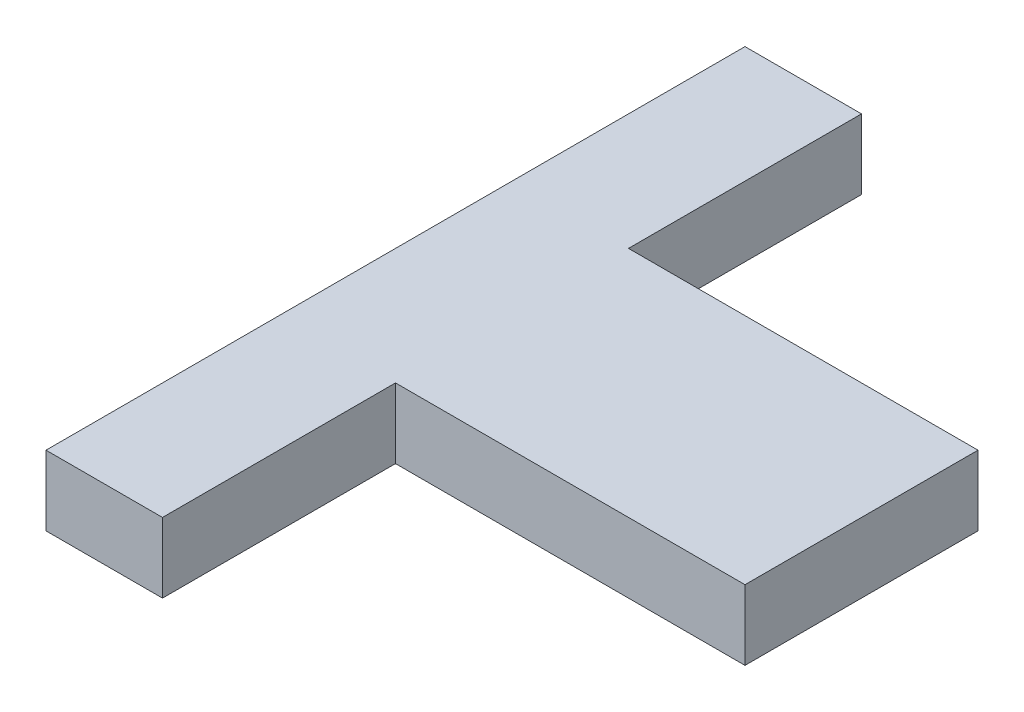
ISO-10303-21;
HEADER;
FILE_DESCRIPTION(('STEP AP214'),'2;1');
FILE_NAME('part.step','',(''),(''),'','','');
FILE_SCHEMA(('AUTOMOTIVE_DESIGN { 1 0 10303 214 1 1 1 1 }'));
ENDSEC;
DATA;
#1=APPLICATION_CONTEXT('core data for automotive mechanical design processes');
#2=APPLICATION_PROTOCOL_DEFINITION('international standard','automotive_design',2000,#1);
#3=PRODUCT_CONTEXT('',#1,'mechanical');
#4=PRODUCT('Part','Part','',(#3));
#5=PRODUCT_RELATED_PRODUCT_CATEGORY('part','',(#4));
#6=PRODUCT_DEFINITION_FORMATION('','',#4);
#7=PRODUCT_DEFINITION_CONTEXT('part definition',#1,'design');
#8=PRODUCT_DEFINITION('design','',#6,#7);
#9=PRODUCT_DEFINITION_SHAPE('','',#8);
#10=(LENGTH_UNIT() NAMED_UNIT(*) SI_UNIT(.MILLI.,.METRE.));
#11=(NAMED_UNIT(*) PLANE_ANGLE_UNIT() SI_UNIT($,.RADIAN.));
#12=(NAMED_UNIT(*) SI_UNIT($,.STERADIAN.) SOLID_ANGLE_UNIT());
#13=UNCERTAINTY_MEASURE_WITH_UNIT(LENGTH_MEASURE(1.E-05),#10,'distance_accuracy_value','');
#14=(GEOMETRIC_REPRESENTATION_CONTEXT(3) GLOBAL_UNCERTAINTY_ASSIGNED_CONTEXT((#13)) GLOBAL_UNIT_ASSIGNED_CONTEXT((#10,
#11,#12)) REPRESENTATION_CONTEXT('',''));
#15=CARTESIAN_POINT('',(0.,0.,0.));
#16=DIRECTION('',(0.,0.,1.));
#17=DIRECTION('',(1.,0.,0.));
#18=AXIS2_PLACEMENT_3D('',#15,#16,#17);
#19=CARTESIAN_POINT('',(10.,6.,0.));
#20=DIRECTION('',(1.,0.,0.));
#21=DIRECTION('',(0.,0.,-1.));
#22=AXIS2_PLACEMENT_3D('',#19,#20,#21);
#23=PLANE('',#22);
#24=DIRECTION('',(0.,0.,1.));
#25=VECTOR('',#24,1.);
#26=CARTESIAN_POINT('',(10.,0.,0.));
#27=LINE('',#26,#25);
#28=CARTESIAN_POINT('',(10.,0.,0.));
#29=VERTEX_POINT('',#28);
#30=CARTESIAN_POINT('',(10.,0.,20.));
#31=VERTEX_POINT('',#30);
#32=EDGE_CURVE('E128',#29,#31,#27,.T.);
#33=ORIENTED_EDGE('',*,*,#32,.F.);
#34=DIRECTION('',(0.,-1.,0.));
#35=VECTOR('',#34,1.);
#36=CARTESIAN_POINT('',(10.,6.,0.));
#37=LINE('',#36,#35);
#38=CARTESIAN_POINT('',(10.,6.,0.));
#39=VERTEX_POINT('',#38);
#40=EDGE_CURVE('E11',#39,#29,#37,.T.);
#41=ORIENTED_EDGE('',*,*,#40,.F.);
#42=DIRECTION('',(0.,0.,1.));
#43=VECTOR('',#42,1.);
#44=CARTESIAN_POINT('',(10.,6.,0.));
#45=LINE('',#44,#43);
#46=CARTESIAN_POINT('',(10.,6.,20.));
#47=VERTEX_POINT('',#46);
#48=EDGE_CURVE('E145',#39,#47,#45,.T.);
#49=ORIENTED_EDGE('',*,*,#48,.T.);
#50=DIRECTION('',(0.,-1.,0.));
#51=VECTOR('',#50,1.);
#52=CARTESIAN_POINT('',(10.,6.,20.));
#53=LINE('',#52,#51);
#54=EDGE_CURVE('E52',#47,#31,#53,.T.);
#55=ORIENTED_EDGE('',*,*,#54,.T.);
#56=EDGE_LOOP('',(#33,#41,#49,#55));
#57=FACE_BOUND('',#56,.T.);
#58=ADVANCED_FACE('F35',(#57),#23,.T.);
#59=CARTESIAN_POINT('',(0.,6.,0.));
#60=DIRECTION('',(0.,0.,-1.));
#61=DIRECTION('',(-1.,0.,0.));
#62=AXIS2_PLACEMENT_3D('',#59,#60,#61);
#63=PLANE('',#62);
#64=DIRECTION('',(1.,0.,0.));
#65=VECTOR('',#64,1.);
#66=CARTESIAN_POINT('',(0.,0.,0.));
#67=LINE('',#66,#65);
#68=CARTESIAN_POINT('',(0.,0.,0.));
#69=VERTEX_POINT('',#68);
#70=EDGE_CURVE('E130',#69,#29,#67,.T.);
#71=ORIENTED_EDGE('',*,*,#70,.F.);
#72=DIRECTION('',(0.,-1.,0.));
#73=VECTOR('',#72,1.);
#74=CARTESIAN_POINT('',(0.,6.,0.));
#75=LINE('',#74,#73);
#76=CARTESIAN_POINT('',(0.,6.,0.));
#77=VERTEX_POINT('',#76);
#78=EDGE_CURVE('E44',#77,#69,#75,.T.);
#79=ORIENTED_EDGE('',*,*,#78,.F.);
#80=DIRECTION('',(1.,0.,0.));
#81=VECTOR('',#80,1.);
#82=CARTESIAN_POINT('',(0.,6.,0.));
#83=LINE('',#82,#81);
#84=EDGE_CURVE('E167',#77,#39,#83,.T.);
#85=ORIENTED_EDGE('',*,*,#84,.T.);
#86=ORIENTED_EDGE('',*,*,#40,.T.);
#87=EDGE_LOOP('',(#71,#79,#85,#86));
#88=FACE_BOUND('',#87,.T.);
#89=ADVANCED_FACE('F37',(#88),#63,.T.);
#90=CARTESIAN_POINT('',(0.,6.,0.));
#91=DIRECTION('',(1.,0.,0.));
#92=DIRECTION('',(0.,0.,-1.));
#93=AXIS2_PLACEMENT_3D('',#90,#91,#92);
#94=PLANE('',#93);
#95=DIRECTION('',(0.,0.,1.));
#96=VECTOR('',#95,1.);
#97=CARTESIAN_POINT('',(0.,0.,0.));
#98=LINE('',#97,#96);
#99=CARTESIAN_POINT('',(0.,0.,60.));
#100=VERTEX_POINT('',#99);
#101=EDGE_CURVE('E134',#69,#100,#98,.T.);
#102=ORIENTED_EDGE('',*,*,#101,.T.);
#103=DIRECTION('',(0.,-1.,0.));
#104=VECTOR('',#103,1.);
#105=CARTESIAN_POINT('',(0.,6.,60.));
#106=LINE('',#105,#104);
#107=CARTESIAN_POINT('',(0.,6.,60.));
#108=VERTEX_POINT('',#107);
#109=EDGE_CURVE('E151',#108,#100,#106,.T.);
#110=ORIENTED_EDGE('',*,*,#109,.F.);
#111=DIRECTION('',(0.,0.,1.));
#112=VECTOR('',#111,1.);
#113=CARTESIAN_POINT('',(0.,6.,0.));
#114=LINE('',#113,#112);
#115=EDGE_CURVE('E158',#77,#108,#114,.T.);
#116=ORIENTED_EDGE('',*,*,#115,.F.);
#117=ORIENTED_EDGE('',*,*,#78,.T.);
#118=EDGE_LOOP('',(#102,#110,#116,#117));
#119=FACE_BOUND('',#118,.T.);
#120=ADVANCED_FACE('F156',(#119),#94,.F.);
#121=CARTESIAN_POINT('',(0.,6.,60.));
#122=DIRECTION('',(0.,0.,-1.));
#123=DIRECTION('',(-1.,0.,0.));
#124=AXIS2_PLACEMENT_3D('',#121,#122,#123);
#125=PLANE('',#124);
#126=DIRECTION('',(1.,0.,0.));
#127=VECTOR('',#126,1.);
#128=CARTESIAN_POINT('',(0.,0.,60.));
#129=LINE('',#128,#127);
#130=CARTESIAN_POINT('',(10.,0.,60.));
#131=VERTEX_POINT('',#130);
#132=EDGE_CURVE('E136',#100,#131,#129,.T.);
#133=ORIENTED_EDGE('',*,*,#132,.T.);
#134=DIRECTION('',(0.,-1.,0.));
#135=VECTOR('',#134,1.);
#136=CARTESIAN_POINT('',(10.,6.,60.));
#137=LINE('',#136,#135);
#138=CARTESIAN_POINT('',(10.,6.,60.));
#139=VERTEX_POINT('',#138);
#140=EDGE_CURVE('E149',#139,#131,#137,.T.);
#141=ORIENTED_EDGE('',*,*,#140,.F.);
#142=DIRECTION('',(1.,0.,0.));
#143=VECTOR('',#142,1.);
#144=CARTESIAN_POINT('',(0.,6.,60.));
#145=LINE('',#144,#143);
#146=EDGE_CURVE('E197',#108,#139,#145,.T.);
#147=ORIENTED_EDGE('',*,*,#146,.F.);
#148=ORIENTED_EDGE('',*,*,#109,.T.);
#149=EDGE_LOOP('',(#133,#141,#147,#148));
#150=FACE_BOUND('',#149,.T.);
#151=ADVANCED_FACE('F187',(#150),#125,.F.);
#152=CARTESIAN_POINT('',(10.,0.,40.));
#153=VERTEX_POINT('',#152);
#154=EDGE_CURVE('E131',#153,#131,#27,.T.);
#155=ORIENTED_EDGE('',*,*,#154,.F.);
#156=DIRECTION('',(0.,-1.,0.));
#157=VECTOR('',#156,1.);
#158=CARTESIAN_POINT('',(10.,6.,40.));
#159=LINE('',#158,#157);
#160=CARTESIAN_POINT('',(10.,6.,40.));
#161=VERTEX_POINT('',#160);
#162=EDGE_CURVE('E120',#161,#153,#159,.T.);
#163=ORIENTED_EDGE('',*,*,#162,.F.);
#164=EDGE_CURVE('E110',#161,#139,#45,.T.);
#165=ORIENTED_EDGE('',*,*,#164,.T.);
#166=ORIENTED_EDGE('',*,*,#140,.T.);
#167=EDGE_LOOP('',(#155,#163,#165,#166));
#168=FACE_BOUND('',#167,.T.);
#169=ADVANCED_FACE('F180',(#168),#23,.T.);
#170=CARTESIAN_POINT('',(0.,6.,40.));
#171=DIRECTION('',(0.,0.,-1.));
#172=DIRECTION('',(-1.,0.,0.));
#173=AXIS2_PLACEMENT_3D('',#170,#171,#172);
#174=PLANE('',#173);
#175=DIRECTION('',(1.,0.,0.));
#176=VECTOR('',#175,1.);
#177=CARTESIAN_POINT('',(0.,0.,40.));
#178=LINE('',#177,#176);
#179=CARTESIAN_POINT('',(40.,0.,40.));
#180=VERTEX_POINT('',#179);
#181=EDGE_CURVE('E117',#153,#180,#178,.T.);
#182=ORIENTED_EDGE('',*,*,#181,.T.);
#183=DIRECTION('',(0.,-1.,0.));
#184=VECTOR('',#183,1.);
#185=CARTESIAN_POINT('',(40.,6.,40.));
#186=LINE('',#185,#184);
#187=CARTESIAN_POINT('',(40.,6.,40.));
#188=VERTEX_POINT('',#187);
#189=EDGE_CURVE('E114',#188,#180,#186,.T.);
#190=ORIENTED_EDGE('',*,*,#189,.F.);
#191=DIRECTION('',(1.,0.,0.));
#192=VECTOR('',#191,1.);
#193=CARTESIAN_POINT('',(0.,6.,40.));
#194=LINE('',#193,#192);
#195=EDGE_CURVE('E103',#161,#188,#194,.T.);
#196=ORIENTED_EDGE('',*,*,#195,.F.);
#197=ORIENTED_EDGE('',*,*,#162,.T.);
#198=EDGE_LOOP('',(#182,#190,#196,#197));
#199=FACE_BOUND('',#198,.T.);
#200=ADVANCED_FACE('F115',(#199),#174,.F.);
#201=CARTESIAN_POINT('',(40.,6.,0.));
#202=DIRECTION('',(1.,0.,0.));
#203=DIRECTION('',(0.,0.,-1.));
#204=AXIS2_PLACEMENT_3D('',#201,#202,#203);
#205=PLANE('',#204);
#206=DIRECTION('',(0.,0.,1.));
#207=VECTOR('',#206,1.);
#208=CARTESIAN_POINT('',(40.,0.,0.));
#209=LINE('',#208,#207);
#210=CARTESIAN_POINT('',(40.,0.,20.));
#211=VERTEX_POINT('',#210);
#212=EDGE_CURVE('E140',#211,#180,#209,.T.);
#213=ORIENTED_EDGE('',*,*,#212,.F.);
#214=DIRECTION('',(0.,-1.,0.));
#215=VECTOR('',#214,1.);
#216=CARTESIAN_POINT('',(40.,6.,20.));
#217=LINE('',#216,#215);
#218=CARTESIAN_POINT('',(40.,6.,20.));
#219=VERTEX_POINT('',#218);
#220=EDGE_CURVE('E77',#219,#211,#217,.T.);
#221=ORIENTED_EDGE('',*,*,#220,.F.);
#222=DIRECTION('',(0.,0.,1.));
#223=VECTOR('',#222,1.);
#224=CARTESIAN_POINT('',(40.,6.,0.));
#225=LINE('',#224,#223);
#226=EDGE_CURVE('E108',#219,#188,#225,.T.);
#227=ORIENTED_EDGE('',*,*,#226,.T.);
#228=ORIENTED_EDGE('',*,*,#189,.T.);
#229=EDGE_LOOP('',(#213,#221,#227,#228));
#230=FACE_BOUND('',#229,.T.);
#231=ADVANCED_FACE('F122',(#230),#205,.T.);
#232=CARTESIAN_POINT('',(0.,6.,20.));
#233=DIRECTION('',(0.,0.,-1.));
#234=DIRECTION('',(-1.,0.,0.));
#235=AXIS2_PLACEMENT_3D('',#232,#233,#234);
#236=PLANE('',#235);
#237=DIRECTION('',(1.,0.,0.));
#238=VECTOR('',#237,1.);
#239=CARTESIAN_POINT('',(0.,0.,20.));
#240=LINE('',#239,#238);
#241=EDGE_CURVE('E142',#31,#211,#240,.T.);
#242=ORIENTED_EDGE('',*,*,#241,.F.);
#243=ORIENTED_EDGE('',*,*,#54,.F.);
#244=DIRECTION('',(1.,0.,0.));
#245=VECTOR('',#244,1.);
#246=CARTESIAN_POINT('',(0.,6.,20.));
#247=LINE('',#246,#245);
#248=EDGE_CURVE('E123',#47,#219,#247,.T.);
#249=ORIENTED_EDGE('',*,*,#248,.T.);
#250=ORIENTED_EDGE('',*,*,#220,.T.);
#251=EDGE_LOOP('',(#242,#243,#249,#250));
#252=FACE_BOUND('',#251,.T.);
#253=ADVANCED_FACE('F168',(#252),#236,.T.);
#254=CARTESIAN_POINT('',(0.,6.,0.));
#255=DIRECTION('',(0.,1.,0.));
#256=DIRECTION('',(0.,0.,1.));
#257=AXIS2_PLACEMENT_3D('',#254,#255,#256);
#258=PLANE('',#257);
#259=ORIENTED_EDGE('',*,*,#48,.F.);
#260=ORIENTED_EDGE('',*,*,#84,.F.);
#261=ORIENTED_EDGE('',*,*,#115,.T.);
#262=ORIENTED_EDGE('',*,*,#146,.T.);
#263=ORIENTED_EDGE('',*,*,#164,.F.);
#264=ORIENTED_EDGE('',*,*,#195,.T.);
#265=ORIENTED_EDGE('',*,*,#226,.F.);
#266=ORIENTED_EDGE('',*,*,#248,.F.);
#267=EDGE_LOOP('',(#259,#260,#261,#262,#263,#264,#265,#266));
#268=FACE_BOUND('',#267,.T.);
#269=ADVANCED_FACE('F105',(#268),#258,.T.);
#270=CARTESIAN_POINT('',(0.,0.,0.));
#271=DIRECTION('',(0.,1.,0.));
#272=DIRECTION('',(0.,0.,1.));
#273=AXIS2_PLACEMENT_3D('',#270,#271,#272);
#274=PLANE('',#273);
#275=ORIENTED_EDGE('',*,*,#32,.T.);
#276=ORIENTED_EDGE('',*,*,#241,.T.);
#277=ORIENTED_EDGE('',*,*,#212,.T.);
#278=ORIENTED_EDGE('',*,*,#181,.F.);
#279=ORIENTED_EDGE('',*,*,#154,.T.);
#280=ORIENTED_EDGE('',*,*,#132,.F.);
#281=ORIENTED_EDGE('',*,*,#101,.F.);
#282=ORIENTED_EDGE('',*,*,#70,.T.);
#283=EDGE_LOOP('',(#275,#276,#277,#278,#279,#280,#281,#282));
#284=FACE_BOUND('',#283,.T.);
#285=ADVANCED_FACE('F165',(#284),#274,.F.);
#286=CLOSED_SHELL('',(#58,#89,#120,#151,#169,#200,#231,#253,#269,#285));
#287=MANIFOLD_SOLID_BREP('B2',#286);
#288=ADVANCED_BREP_SHAPE_REPRESENTATION('',(#18,#287),#14);
#289=SHAPE_DEFINITION_REPRESENTATION(#9,#288);
ENDSEC;
END-ISO-10303-21;
